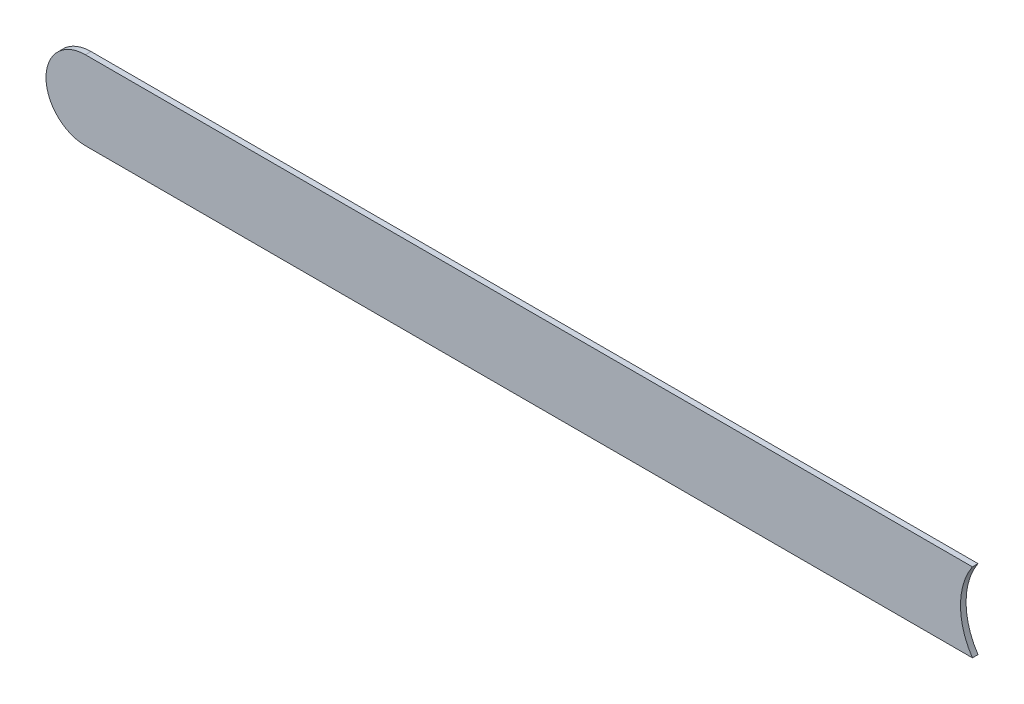
ISO-10303-21;
HEADER;
FILE_DESCRIPTION(('STEP AP214'),'2;1');
FILE_NAME('part.step','',(''),(''),'','','');
FILE_SCHEMA(('AUTOMOTIVE_DESIGN { 1 0 10303 214 1 1 1 1 }'));
ENDSEC;
DATA;
#1=APPLICATION_CONTEXT('core data for automotive mechanical design processes');
#2=APPLICATION_PROTOCOL_DEFINITION('international standard','automotive_design',2000,#1);
#3=PRODUCT_CONTEXT('',#1,'mechanical');
#4=PRODUCT('Part','Part','',(#3));
#5=PRODUCT_RELATED_PRODUCT_CATEGORY('part','',(#4));
#6=PRODUCT_DEFINITION_FORMATION('','',#4);
#7=PRODUCT_DEFINITION_CONTEXT('part definition',#1,'design');
#8=PRODUCT_DEFINITION('design','',#6,#7);
#9=PRODUCT_DEFINITION_SHAPE('','',#8);
#10=(LENGTH_UNIT() NAMED_UNIT(*) SI_UNIT(.MILLI.,.METRE.));
#11=(NAMED_UNIT(*) PLANE_ANGLE_UNIT() SI_UNIT($,.RADIAN.));
#12=(NAMED_UNIT(*) SI_UNIT($,.STERADIAN.) SOLID_ANGLE_UNIT());
#13=UNCERTAINTY_MEASURE_WITH_UNIT(LENGTH_MEASURE(1.E-05),#10,'distance_accuracy_value','');
#14=(GEOMETRIC_REPRESENTATION_CONTEXT(3) GLOBAL_UNCERTAINTY_ASSIGNED_CONTEXT((#13)) GLOBAL_UNIT_ASSIGNED_CONTEXT((#10,
#11,#12)) REPRESENTATION_CONTEXT('',''));
#15=CARTESIAN_POINT('',(0.,0.,0.));
#16=DIRECTION('',(0.,0.,1.));
#17=DIRECTION('',(1.,0.,0.));
#18=AXIS2_PLACEMENT_3D('',#15,#16,#17);
#19=CARTESIAN_POINT('',(37.4599708,62.3499769,0.));
#20=DIRECTION('',(0.,1.,0.));
#21=DIRECTION('',(1.,0.,0.));
#22=AXIS2_PLACEMENT_3D('',#19,#20,#21);
#23=PLANE('',#22);
#24=DIRECTION('',(1.,0.,0.));
#25=VECTOR('',#24,1.);
#26=CARTESIAN_POINT('',(37.4599708,62.3499769,0.03556));
#27=LINE('',#26,#25);
#28=CARTESIAN_POINT('',(37.4599708,62.3499769,0.03556));
#29=VERTEX_POINT('',#28);
#30=CARTESIAN_POINT('',(43.0858446096541,62.3499769,0.03556));
#31=VERTEX_POINT('',#30);
#32=EDGE_CURVE('E11',#29,#31,#27,.T.);
#33=ORIENTED_EDGE('',*,*,#32,.F.);
#34=DIRECTION('',(0.,0.,1.));
#35=VECTOR('',#34,1.);
#36=CARTESIAN_POINT('',(37.4599708,62.3499769,0.));
#37=LINE('',#36,#35);
#38=CARTESIAN_POINT('',(37.4599708,62.3499769,0.));
#39=VERTEX_POINT('',#38);
#40=EDGE_CURVE('E24',#39,#29,#37,.T.);
#41=ORIENTED_EDGE('',*,*,#40,.F.);
#42=DIRECTION('',(1.,0.,0.));
#43=VECTOR('',#42,1.);
#44=CARTESIAN_POINT('',(37.4599708,62.3499769,0.));
#45=LINE('',#44,#43);
#46=CARTESIAN_POINT('',(43.0858446096541,62.3499769,0.));
#47=VERTEX_POINT('',#46);
#48=EDGE_CURVE('E75',#39,#47,#45,.T.);
#49=ORIENTED_EDGE('',*,*,#48,.T.);
#50=DIRECTION('',(0.,0.,1.));
#51=VECTOR('',#50,1.);
#52=CARTESIAN_POINT('',(43.0858446096541,62.3499769,0.));
#53=LINE('',#52,#51);
#54=EDGE_CURVE('E37',#47,#31,#53,.T.);
#55=ORIENTED_EDGE('',*,*,#54,.T.);
#56=EDGE_LOOP('',(#33,#41,#49,#55));
#57=FACE_BOUND('',#56,.T.);
#58=ADVANCED_FACE('F17',(#57),#23,.F.);
#59=CARTESIAN_POINT('',(43.4600096,62.5999764,0.));
#60=DIRECTION('',(0.,0.,-1.));
#61=DIRECTION('',(1.,0.,0.));
#62=AXIS2_PLACEMENT_3D('',#59,#60,#61);
#63=CYLINDRICAL_SURFACE('',#62,0.4499991);
#64=DIRECTION('',(0.,0.,1.));
#65=VECTOR('',#64,1.);
#66=CARTESIAN_POINT('',(43.0858446096541,62.8499759,0.));
#67=LINE('',#66,#65);
#68=CARTESIAN_POINT('',(43.0858446096541,62.8499759,0.));
#69=VERTEX_POINT('',#68);
#70=CARTESIAN_POINT('',(43.0858446096541,62.8499759,0.03556));
#71=VERTEX_POINT('',#70);
#72=EDGE_CURVE('E67',#69,#71,#67,.T.);
#73=ORIENTED_EDGE('',*,*,#72,.T.);
#74=CARTESIAN_POINT('',(43.4600096,62.5999764,0.03556));
#75=DIRECTION('',(0.,0.,1.));
#76=DIRECTION('',(1.,0.,0.));
#77=AXIS2_PLACEMENT_3D('',#74,#75,#76);
#78=CIRCLE('',#77,0.4499991);
#79=EDGE_CURVE('E82',#71,#31,#78,.T.);
#80=ORIENTED_EDGE('',*,*,#79,.T.);
#81=ORIENTED_EDGE('',*,*,#54,.F.);
#82=CARTESIAN_POINT('',(43.4600096,62.5999764,0.));
#83=DIRECTION('',(0.,0.,1.));
#84=DIRECTION('',(1.,0.,0.));
#85=AXIS2_PLACEMENT_3D('',#82,#83,#84);
#86=CIRCLE('',#85,0.4499991);
#87=EDGE_CURVE('E80',#69,#47,#86,.T.);
#88=ORIENTED_EDGE('',*,*,#87,.F.);
#89=EDGE_LOOP('',(#73,#80,#81,#88));
#90=FACE_BOUND('',#89,.T.);
#91=ADVANCED_FACE('F88',(#90),#63,.F.);
#92=CARTESIAN_POINT('',(43.0858446096541,62.8499759,0.));
#93=DIRECTION('',(0.,-1.,0.));
#94=DIRECTION('',(-1.,0.,0.));
#95=AXIS2_PLACEMENT_3D('',#92,#93,#94);
#96=PLANE('',#95);
#97=DIRECTION('',(-1.,0.,0.));
#98=VECTOR('',#97,1.);
#99=CARTESIAN_POINT('',(43.4600096,62.8499759,0.03556));
#100=LINE('',#99,#98);
#101=CARTESIAN_POINT('',(37.4599708,62.8499759,0.03556));
#102=VERTEX_POINT('',#101);
#103=EDGE_CURVE('E71',#71,#102,#100,.T.);
#104=ORIENTED_EDGE('',*,*,#103,.F.);
#105=ORIENTED_EDGE('',*,*,#72,.F.);
#106=DIRECTION('',(-1.,0.,0.));
#107=VECTOR('',#106,1.);
#108=CARTESIAN_POINT('',(43.4600096,62.8499759,0.));
#109=LINE('',#108,#107);
#110=CARTESIAN_POINT('',(37.4599708,62.8499759,0.));
#111=VERTEX_POINT('',#110);
#112=EDGE_CURVE('E63',#69,#111,#109,.T.);
#113=ORIENTED_EDGE('',*,*,#112,.T.);
#114=DIRECTION('',(0.,0.,1.));
#115=VECTOR('',#114,1.);
#116=CARTESIAN_POINT('',(37.4599708,62.8499759,0.));
#117=LINE('',#116,#115);
#118=EDGE_CURVE('E53',#111,#102,#117,.T.);
#119=ORIENTED_EDGE('',*,*,#118,.T.);
#120=EDGE_LOOP('',(#104,#105,#113,#119));
#121=FACE_BOUND('',#120,.T.);
#122=ADVANCED_FACE('F66',(#121),#96,.F.);
#123=CARTESIAN_POINT('',(37.4599708,62.5999764,0.));
#124=DIRECTION('',(0.,0.,-1.));
#125=DIRECTION('',(0.,1.,0.));
#126=AXIS2_PLACEMENT_3D('',#123,#124,#125);
#127=CYLINDRICAL_SURFACE('',#126,0.249999500000001);
#128=CARTESIAN_POINT('',(37.4599708,62.5999764,0.03556));
#129=DIRECTION('',(0.,0.,1.));
#130=DIRECTION('',(0.,1.,0.));
#131=AXIS2_PLACEMENT_3D('',#128,#129,#130);
#132=CIRCLE('',#131,0.249999500000001);
#133=EDGE_CURVE('E59',#102,#29,#132,.T.);
#134=ORIENTED_EDGE('',*,*,#133,.F.);
#135=ORIENTED_EDGE('',*,*,#118,.F.);
#136=CARTESIAN_POINT('',(37.4599708,62.5999764,0.));
#137=DIRECTION('',(0.,0.,1.));
#138=DIRECTION('',(0.,1.,0.));
#139=AXIS2_PLACEMENT_3D('',#136,#137,#138);
#140=CIRCLE('',#139,0.249999500000001);
#141=EDGE_CURVE('E57',#111,#39,#140,.T.);
#142=ORIENTED_EDGE('',*,*,#141,.T.);
#143=ORIENTED_EDGE('',*,*,#40,.T.);
#144=EDGE_LOOP('',(#134,#135,#142,#143));
#145=FACE_BOUND('',#144,.T.);
#146=ADVANCED_FACE('F55',(#145),#127,.T.);
#147=CARTESIAN_POINT('',(37.4599708,62.3499769,0.));
#148=DIRECTION('',(0.,0.,-1.));
#149=DIRECTION('',(-1.,0.,0.));
#150=AXIS2_PLACEMENT_3D('',#147,#148,#149);
#151=PLANE('',#150);
#152=ORIENTED_EDGE('',*,*,#48,.F.);
#153=ORIENTED_EDGE('',*,*,#141,.F.);
#154=ORIENTED_EDGE('',*,*,#112,.F.);
#155=ORIENTED_EDGE('',*,*,#87,.T.);
#156=EDGE_LOOP('',(#152,#153,#154,#155));
#157=FACE_BOUND('',#156,.T.);
#158=ADVANCED_FACE('F74',(#157),#151,.T.);
#159=CARTESIAN_POINT('',(37.4599708,62.3499769,0.03556));
#160=DIRECTION('',(0.,0.,-1.));
#161=DIRECTION('',(-1.,0.,0.));
#162=AXIS2_PLACEMENT_3D('',#159,#160,#161);
#163=PLANE('',#162);
#164=ORIENTED_EDGE('',*,*,#133,.T.);
#165=ORIENTED_EDGE('',*,*,#32,.T.);
#166=ORIENTED_EDGE('',*,*,#79,.F.);
#167=ORIENTED_EDGE('',*,*,#103,.T.);
#168=EDGE_LOOP('',(#164,#165,#166,#167));
#169=FACE_BOUND('',#168,.T.);
#170=ADVANCED_FACE('F91',(#169),#163,.F.);
#171=CLOSED_SHELL('',(#58,#91,#122,#146,#158,#170));
#172=MANIFOLD_SOLID_BREP('B1',#171);
#173=ADVANCED_BREP_SHAPE_REPRESENTATION('',(#18,#172),#14);
#174=SHAPE_DEFINITION_REPRESENTATION(#9,#173);
ENDSEC;
END-ISO-10303-21;
